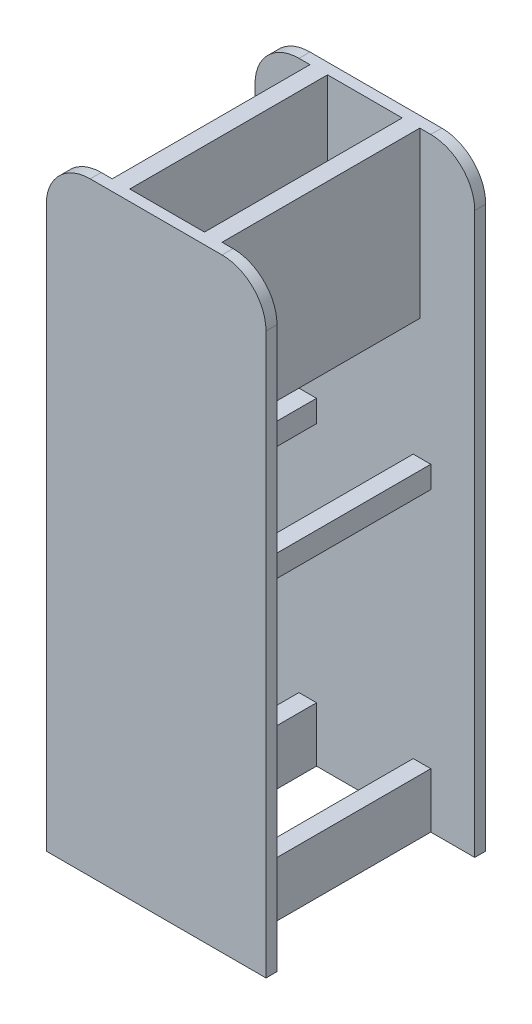
ISO-10303-21;
HEADER;
FILE_DESCRIPTION(('STEP AP214'),'2;1');
FILE_NAME('part.step','',(''),(''),'','','');
FILE_SCHEMA(('AUTOMOTIVE_DESIGN { 1 0 10303 214 1 1 1 1 }'));
ENDSEC;
DATA;
#1=APPLICATION_CONTEXT('core data for automotive mechanical design processes');
#2=APPLICATION_PROTOCOL_DEFINITION('international standard','automotive_design',2000,#1);
#3=PRODUCT_CONTEXT('',#1,'mechanical');
#4=PRODUCT('Part','Part','',(#3));
#5=PRODUCT_RELATED_PRODUCT_CATEGORY('part','',(#4));
#6=PRODUCT_DEFINITION_FORMATION('','',#4);
#7=PRODUCT_DEFINITION_CONTEXT('part definition',#1,'design');
#8=PRODUCT_DEFINITION('design','',#6,#7);
#9=PRODUCT_DEFINITION_SHAPE('','',#8);
#10=(LENGTH_UNIT() NAMED_UNIT(*) SI_UNIT(.MILLI.,.METRE.));
#11=(NAMED_UNIT(*) PLANE_ANGLE_UNIT() SI_UNIT($,.RADIAN.));
#12=(NAMED_UNIT(*) SI_UNIT($,.STERADIAN.) SOLID_ANGLE_UNIT());
#13=UNCERTAINTY_MEASURE_WITH_UNIT(LENGTH_MEASURE(1.E-05),#10,'distance_accuracy_value','');
#14=(GEOMETRIC_REPRESENTATION_CONTEXT(3) GLOBAL_UNCERTAINTY_ASSIGNED_CONTEXT((#13)) GLOBAL_UNIT_ASSIGNED_CONTEXT((#10,
#11,#12)) REPRESENTATION_CONTEXT('',''));
#15=CARTESIAN_POINT('',(0.,0.,0.));
#16=DIRECTION('',(0.,0.,1.));
#17=DIRECTION('',(1.,0.,0.));
#18=AXIS2_PLACEMENT_3D('',#15,#16,#17);
#19=CARTESIAN_POINT('',(0.,0.,10.));
#20=DIRECTION('',(0.,0.,-1.));
#21=DIRECTION('',(-1.,0.,0.));
#22=AXIS2_PLACEMENT_3D('',#19,#20,#21);
#23=PLANE('',#22);
#24=DIRECTION('',(-1.,0.,0.));
#25=VECTOR('',#24,1.);
#26=CARTESIAN_POINT('',(56.,290.,10.));
#27=LINE('',#26,#25);
#28=CARTESIAN_POINT('',(56.,290.,10.));
#29=VERTEX_POINT('',#28);
#30=CARTESIAN_POINT('',(40.,290.,10.));
#31=VERTEX_POINT('',#30);
#32=EDGE_CURVE('E418',#29,#31,#27,.T.);
#33=ORIENTED_EDGE('',*,*,#32,.F.);
#34=DIRECTION('',(0.,1.,0.));
#35=VECTOR('',#34,1.);
#36=CARTESIAN_POINT('',(56.,290.,10.));
#37=LINE('',#36,#35);
#38=CARTESIAN_POINT('',(56.,270.,10.));
#39=VERTEX_POINT('',#38);
#40=EDGE_CURVE('E430',#39,#29,#37,.T.);
#41=ORIENTED_EDGE('',*,*,#40,.F.);
#42=DIRECTION('',(1.,0.,0.));
#43=VECTOR('',#42,1.);
#44=CARTESIAN_POINT('',(56.,270.,10.));
#45=LINE('',#44,#43);
#46=CARTESIAN_POINT('',(40.0000000000001,270.,10.));
#47=VERTEX_POINT('',#46);
#48=EDGE_CURVE('E426',#47,#39,#45,.T.);
#49=ORIENTED_EDGE('',*,*,#48,.F.);
#50=DIRECTION('',(0.,-1.,0.));
#51=VECTOR('',#50,1.);
#52=CARTESIAN_POINT('',(40.,290.,10.));
#53=LINE('',#52,#51);
#54=EDGE_CURVE('E422',#31,#47,#53,.T.);
#55=ORIENTED_EDGE('',*,*,#54,.F.);
#56=EDGE_LOOP('',(#33,#41,#49,#55));
#57=FACE_BOUND('',#56,.T.);
#58=DIRECTION('',(0.,-1.,0.));
#59=VECTOR('',#58,1.);
#60=CARTESIAN_POINT('',(144.,290.,10.));
#61=LINE('',#60,#59);
#62=CARTESIAN_POINT('',(144.,290.,10.));
#63=VERTEX_POINT('',#62);
#64=CARTESIAN_POINT('',(144.,270.,10.));
#65=VERTEX_POINT('',#64);
#66=EDGE_CURVE('E478',#63,#65,#61,.T.);
#67=ORIENTED_EDGE('',*,*,#66,.F.);
#68=DIRECTION('',(-1.,0.,0.));
#69=VECTOR('',#68,1.);
#70=CARTESIAN_POINT('',(144.,290.,10.));
#71=LINE('',#70,#69);
#72=CARTESIAN_POINT('',(160.,290.,10.));
#73=VERTEX_POINT('',#72);
#74=EDGE_CURVE('E490',#73,#63,#71,.T.);
#75=ORIENTED_EDGE('',*,*,#74,.F.);
#76=DIRECTION('',(0.,1.,0.));
#77=VECTOR('',#76,1.);
#78=CARTESIAN_POINT('',(160.,290.,10.));
#79=LINE('',#78,#77);
#80=CARTESIAN_POINT('',(160.,270.,10.));
#81=VERTEX_POINT('',#80);
#82=EDGE_CURVE('E486',#81,#73,#79,.T.);
#83=ORIENTED_EDGE('',*,*,#82,.F.);
#84=DIRECTION('',(1.,0.,0.));
#85=VECTOR('',#84,1.);
#86=CARTESIAN_POINT('',(144.,270.,10.));
#87=LINE('',#86,#85);
#88=EDGE_CURVE('E482',#65,#81,#87,.T.);
#89=ORIENTED_EDGE('',*,*,#88,.F.);
#90=EDGE_LOOP('',(#67,#75,#83,#89));
#91=FACE_BOUND('',#90,.T.);
#92=DIRECTION('',(0.,1.,0.));
#93=VECTOR('',#92,1.);
#94=CARTESIAN_POINT('',(66.,550.,10.));
#95=LINE('',#94,#93);
#96=CARTESIAN_POINT('',(66.,400.,10.));
#97=VERTEX_POINT('',#96);
#98=CARTESIAN_POINT('',(66.,550.,10.));
#99=VERTEX_POINT('',#98);
#100=EDGE_CURVE('E390',#97,#99,#95,.T.);
#101=ORIENTED_EDGE('',*,*,#100,.F.);
#102=DIRECTION('',(1.,0.,0.));
#103=VECTOR('',#102,1.);
#104=CARTESIAN_POINT('',(66.,400.,10.));
#105=LINE('',#104,#103);
#106=CARTESIAN_POINT('',(50.,400.,10.));
#107=VERTEX_POINT('',#106);
#108=EDGE_CURVE('E398',#107,#97,#105,.T.);
#109=ORIENTED_EDGE('',*,*,#108,.F.);
#110=DIRECTION('',(0.,-1.,0.));
#111=VECTOR('',#110,1.);
#112=CARTESIAN_POINT('',(50.,550.,10.));
#113=LINE('',#112,#111);
#114=CARTESIAN_POINT('',(50.,550.,10.));
#115=VERTEX_POINT('',#114);
#116=EDGE_CURVE('E394',#115,#107,#113,.T.);
#117=ORIENTED_EDGE('',*,*,#116,.F.);
#118=DIRECTION('',(-1.,0.,0.));
#119=VECTOR('',#118,1.);
#120=CARTESIAN_POINT('',(0.,550.,10.));
#121=LINE('',#120,#119);
#122=CARTESIAN_POINT('',(40.,550.,10.));
#123=VERTEX_POINT('',#122);
#124=EDGE_CURVE('E580',#115,#123,#121,.T.);
#125=ORIENTED_EDGE('',*,*,#124,.T.);
#126=CARTESIAN_POINT('',(40.,510.,10.));
#127=DIRECTION('',(0.,0.,-1.));
#128=DIRECTION('',(-1.,0.,0.));
#129=AXIS2_PLACEMENT_3D('',#126,#127,#128);
#130=CIRCLE('',#129,40.);
#131=CARTESIAN_POINT('',(0.,510.,10.));
#132=VERTEX_POINT('',#131);
#133=EDGE_CURVE('E626',#123,#132,#130,.F.);
#134=ORIENTED_EDGE('',*,*,#133,.T.);
#135=DIRECTION('',(0.,-1.,0.));
#136=VECTOR('',#135,1.);
#137=CARTESIAN_POINT('',(0.,0.,10.));
#138=LINE('',#137,#136);
#139=CARTESIAN_POINT('',(0.,0.,10.));
#140=VERTEX_POINT('',#139);
#141=EDGE_CURVE('E567',#132,#140,#138,.T.);
#142=ORIENTED_EDGE('',*,*,#141,.T.);
#143=DIRECTION('',(1.,0.,0.));
#144=VECTOR('',#143,1.);
#145=CARTESIAN_POINT('',(0.,0.,10.));
#146=LINE('',#145,#144);
#147=CARTESIAN_POINT('',(40.,0.,10.));
#148=VERTEX_POINT('',#147);
#149=EDGE_CURVE('E572',#140,#148,#146,.T.);
#150=ORIENTED_EDGE('',*,*,#149,.T.);
#151=DIRECTION('',(0.,-1.,0.));
#152=VECTOR('',#151,1.);
#153=CARTESIAN_POINT('',(40.,0.,10.));
#154=LINE('',#153,#152);
#155=CARTESIAN_POINT('',(40.,50.,10.));
#156=VERTEX_POINT('',#155);
#157=EDGE_CURVE('E458',#156,#148,#154,.T.);
#158=ORIENTED_EDGE('',*,*,#157,.F.);
#159=DIRECTION('',(-1.,0.,0.));
#160=VECTOR('',#159,1.);
#161=CARTESIAN_POINT('',(56.,50.,10.));
#162=LINE('',#161,#160);
#163=CARTESIAN_POINT('',(56.,50.,10.));
#164=VERTEX_POINT('',#163);
#165=EDGE_CURVE('E454',#164,#156,#162,.T.);
#166=ORIENTED_EDGE('',*,*,#165,.F.);
#167=DIRECTION('',(0.,1.,0.));
#168=VECTOR('',#167,1.);
#169=CARTESIAN_POINT('',(56.,0.,10.));
#170=LINE('',#169,#168);
#171=CARTESIAN_POINT('',(56.,0.,10.));
#172=VERTEX_POINT('',#171);
#173=EDGE_CURVE('E450',#172,#164,#170,.T.);
#174=ORIENTED_EDGE('',*,*,#173,.F.);
#175=CARTESIAN_POINT('',(144.,0.,10.));
#176=VERTEX_POINT('',#175);
#177=EDGE_CURVE('E576',#172,#176,#146,.T.);
#178=ORIENTED_EDGE('',*,*,#177,.T.);
#179=DIRECTION('',(0.,-1.,0.));
#180=VECTOR('',#179,1.);
#181=CARTESIAN_POINT('',(144.,0.,10.));
#182=LINE('',#181,#180);
#183=CARTESIAN_POINT('',(144.,50.,10.));
#184=VERTEX_POINT('',#183);
#185=EDGE_CURVE('E510',#184,#176,#182,.T.);
#186=ORIENTED_EDGE('',*,*,#185,.F.);
#187=DIRECTION('',(-1.,0.,0.));
#188=VECTOR('',#187,1.);
#189=CARTESIAN_POINT('',(144.,50.,10.));
#190=LINE('',#189,#188);
#191=CARTESIAN_POINT('',(160.,50.,10.));
#192=VERTEX_POINT('',#191);
#193=EDGE_CURVE('E518',#192,#184,#190,.T.);
#194=ORIENTED_EDGE('',*,*,#193,.F.);
#195=DIRECTION('',(0.,1.,0.));
#196=VECTOR('',#195,1.);
#197=CARTESIAN_POINT('',(160.,0.,10.));
#198=LINE('',#197,#196);
#199=CARTESIAN_POINT('',(160.,0.,10.));
#200=VERTEX_POINT('',#199);
#201=EDGE_CURVE('E514',#200,#192,#198,.T.);
#202=ORIENTED_EDGE('',*,*,#201,.F.);
#203=CARTESIAN_POINT('',(200.,0.,10.));
#204=VERTEX_POINT('',#203);
#205=EDGE_CURVE('E570',#200,#204,#146,.T.);
#206=ORIENTED_EDGE('',*,*,#205,.T.);
#207=DIRECTION('',(0.,1.,0.));
#208=VECTOR('',#207,1.);
#209=CARTESIAN_POINT('',(200.,0.,10.));
#210=LINE('',#209,#208);
#211=CARTESIAN_POINT('',(200.,510.,10.));
#212=VERTEX_POINT('',#211);
#213=EDGE_CURVE('E575',#204,#212,#210,.T.);
#214=ORIENTED_EDGE('',*,*,#213,.T.);
#215=CARTESIAN_POINT('',(160.,510.,10.));
#216=DIRECTION('',(0.,0.,-1.));
#217=DIRECTION('',(-1.,0.,0.));
#218=AXIS2_PLACEMENT_3D('',#215,#216,#217);
#219=CIRCLE('',#218,40.);
#220=CARTESIAN_POINT('',(160.,550.,10.));
#221=VERTEX_POINT('',#220);
#222=EDGE_CURVE('E623',#212,#221,#219,.F.);
#223=ORIENTED_EDGE('',*,*,#222,.T.);
#224=CARTESIAN_POINT('',(150.,550.,10.));
#225=VERTEX_POINT('',#224);
#226=EDGE_CURVE('E581',#221,#225,#121,.T.);
#227=ORIENTED_EDGE('',*,*,#226,.T.);
#228=DIRECTION('',(0.,1.,0.));
#229=VECTOR('',#228,1.);
#230=CARTESIAN_POINT('',(150.,550.,10.));
#231=LINE('',#230,#229);
#232=CARTESIAN_POINT('',(150.,400.,10.));
#233=VERTEX_POINT('',#232);
#234=EDGE_CURVE('E546',#233,#225,#231,.T.);
#235=ORIENTED_EDGE('',*,*,#234,.F.);
#236=DIRECTION('',(1.,0.,0.));
#237=VECTOR('',#236,1.);
#238=CARTESIAN_POINT('',(134.,400.,10.));
#239=LINE('',#238,#237);
#240=CARTESIAN_POINT('',(134.,400.,10.));
#241=VERTEX_POINT('',#240);
#242=EDGE_CURVE('E542',#241,#233,#239,.T.);
#243=ORIENTED_EDGE('',*,*,#242,.F.);
#244=DIRECTION('',(0.,-1.,0.));
#245=VECTOR('',#244,1.);
#246=CARTESIAN_POINT('',(134.,550.,10.));
#247=LINE('',#246,#245);
#248=CARTESIAN_POINT('',(134.,550.,10.));
#249=VERTEX_POINT('',#248);
#250=EDGE_CURVE('E538',#249,#241,#247,.T.);
#251=ORIENTED_EDGE('',*,*,#250,.F.);
#252=EDGE_CURVE('E585',#249,#99,#121,.T.);
#253=ORIENTED_EDGE('',*,*,#252,.T.);
#254=EDGE_LOOP('',(#101,#109,#117,#125,#134,#142,#150,#158,#166,#174,#178,#186,#194,#202,#206,
#214,#223,#227,#235,#243,#251,#253));
#255=FACE_BOUND('',#254,.T.);
#256=ADVANCED_FACE('F39',(#57,#91,#255),#23,.F.);
#257=CARTESIAN_POINT('',(0.,0.,10.));
#258=DIRECTION('',(1.,0.,0.));
#259=DIRECTION('',(0.,0.,-1.));
#260=AXIS2_PLACEMENT_3D('',#257,#258,#259);
#261=PLANE('',#260);
#262=ORIENTED_EDGE('',*,*,#141,.F.);
#263=DIRECTION('',(0.,0.,-1.));
#264=VECTOR('',#263,1.);
#265=CARTESIAN_POINT('',(0.,510.,10.));
#266=LINE('',#265,#264);
#267=CARTESIAN_POINT('',(0.,510.,0.));
#268=VERTEX_POINT('',#267);
#269=EDGE_CURVE('E605',#132,#268,#266,.T.);
#270=ORIENTED_EDGE('',*,*,#269,.T.);
#271=DIRECTION('',(0.,-1.,0.));
#272=VECTOR('',#271,1.);
#273=CARTESIAN_POINT('',(0.,0.,0.));
#274=LINE('',#273,#272);
#275=CARTESIAN_POINT('',(0.,0.,0.));
#276=VERTEX_POINT('',#275);
#277=EDGE_CURVE('E566',#268,#276,#274,.T.);
#278=ORIENTED_EDGE('',*,*,#277,.T.);
#279=DIRECTION('',(0.,0.,-1.));
#280=VECTOR('',#279,1.);
#281=CARTESIAN_POINT('',(0.,0.,10.));
#282=LINE('',#281,#280);
#283=EDGE_CURVE('E601',#140,#276,#282,.T.);
#284=ORIENTED_EDGE('',*,*,#283,.F.);
#285=EDGE_LOOP('',(#262,#270,#278,#284));
#286=FACE_BOUND('',#285,.T.);
#287=ADVANCED_FACE('F698',(#286),#261,.F.);
#288=CARTESIAN_POINT('',(0.,0.,10.));
#289=DIRECTION('',(0.,1.,0.));
#290=DIRECTION('',(0.,0.,1.));
#291=AXIS2_PLACEMENT_3D('',#288,#289,#290);
#292=PLANE('',#291);
#293=DIRECTION('',(0.,0.,-1.));
#294=VECTOR('',#293,1.);
#295=CARTESIAN_POINT('',(160.,0.,100.));
#296=LINE('',#295,#294);
#297=CARTESIAN_POINT('',(160.,0.,190.));
#298=VERTEX_POINT('',#297);
#299=EDGE_CURVE('E530',#298,#200,#296,.T.);
#300=ORIENTED_EDGE('',*,*,#299,.F.);
#301=DIRECTION('',(1.,0.,0.));
#302=VECTOR('',#301,1.);
#303=CARTESIAN_POINT('',(0.,0.,190.));
#304=LINE('',#303,#302);
#305=CARTESIAN_POINT('',(200.,0.,190.));
#306=VERTEX_POINT('',#305);
#307=EDGE_CURVE('E732',#298,#306,#304,.T.);
#308=ORIENTED_EDGE('',*,*,#307,.T.);
#309=DIRECTION('',(0.,0.,-1.));
#310=VECTOR('',#309,1.);
#311=CARTESIAN_POINT('',(200.,0.,200.));
#312=LINE('',#311,#310);
#313=CARTESIAN_POINT('',(200.,0.,200.));
#314=VERTEX_POINT('',#313);
#315=EDGE_CURVE('E295',#314,#306,#312,.T.);
#316=ORIENTED_EDGE('',*,*,#315,.F.);
#317=DIRECTION('',(1.,0.,0.));
#318=VECTOR('',#317,1.);
#319=CARTESIAN_POINT('',(0.,0.,200.));
#320=LINE('',#319,#318);
#321=CARTESIAN_POINT('',(0.,0.,200.));
#322=VERTEX_POINT('',#321);
#323=EDGE_CURVE('E277',#322,#314,#320,.T.);
#324=ORIENTED_EDGE('',*,*,#323,.F.);
#325=DIRECTION('',(0.,0.,-1.));
#326=VECTOR('',#325,1.);
#327=CARTESIAN_POINT('',(0.,0.,200.));
#328=LINE('',#327,#326);
#329=CARTESIAN_POINT('',(0.,0.,190.));
#330=VERTEX_POINT('',#329);
#331=EDGE_CURVE('E293',#322,#330,#328,.T.);
#332=ORIENTED_EDGE('',*,*,#331,.T.);
#333=CARTESIAN_POINT('',(40.,0.,190.));
#334=VERTEX_POINT('',#333);
#335=EDGE_CURVE('E730',#330,#334,#304,.T.);
#336=ORIENTED_EDGE('',*,*,#335,.T.);
#337=DIRECTION('',(0.,0.,-1.));
#338=VECTOR('',#337,1.);
#339=CARTESIAN_POINT('',(40.,0.,100.));
#340=LINE('',#339,#338);
#341=EDGE_CURVE('E466',#334,#148,#340,.T.);
#342=ORIENTED_EDGE('',*,*,#341,.T.);
#343=ORIENTED_EDGE('',*,*,#149,.F.);
#344=ORIENTED_EDGE('',*,*,#283,.T.);
#345=DIRECTION('',(1.,0.,0.));
#346=VECTOR('',#345,1.);
#347=CARTESIAN_POINT('',(0.,0.,0.));
#348=LINE('',#347,#346);
#349=CARTESIAN_POINT('',(200.,0.,0.));
#350=VERTEX_POINT('',#349);
#351=EDGE_CURVE('E588',#276,#350,#348,.T.);
#352=ORIENTED_EDGE('',*,*,#351,.T.);
#353=DIRECTION('',(0.,0.,-1.));
#354=VECTOR('',#353,1.);
#355=CARTESIAN_POINT('',(200.,0.,10.));
#356=LINE('',#355,#354);
#357=EDGE_CURVE('E584',#204,#350,#356,.T.);
#358=ORIENTED_EDGE('',*,*,#357,.F.);
#359=ORIENTED_EDGE('',*,*,#205,.F.);
#360=EDGE_LOOP('',(#300,#308,#316,#324,#332,#336,#342,#343,#344,#352,#358,#359));
#361=FACE_BOUND('',#360,.T.);
#362=CARTESIAN_POINT('',(56.,0.,190.));
#363=VERTEX_POINT('',#362);
#364=CARTESIAN_POINT('',(144.,0.,190.));
#365=VERTEX_POINT('',#364);
#366=EDGE_CURVE('E735',#363,#365,#304,.T.);
#367=ORIENTED_EDGE('',*,*,#366,.T.);
#368=DIRECTION('',(0.,0.,-1.));
#369=VECTOR('',#368,1.);
#370=CARTESIAN_POINT('',(144.,0.,100.));
#371=LINE('',#370,#369);
#372=EDGE_CURVE('E534',#365,#176,#371,.T.);
#373=ORIENTED_EDGE('',*,*,#372,.T.);
#374=ORIENTED_EDGE('',*,*,#177,.F.);
#375=DIRECTION('',(0.,0.,-1.));
#376=VECTOR('',#375,1.);
#377=CARTESIAN_POINT('',(56.,0.,100.));
#378=LINE('',#377,#376);
#379=EDGE_CURVE('E462',#363,#172,#378,.T.);
#380=ORIENTED_EDGE('',*,*,#379,.F.);
#381=EDGE_LOOP('',(#367,#373,#374,#380));
#382=FACE_BOUND('',#381,.T.);
#383=ADVANCED_FACE('F290',(#361,#382),#292,.F.);
#384=CARTESIAN_POINT('',(200.,0.,10.));
#385=DIRECTION('',(-1.,0.,0.));
#386=DIRECTION('',(0.,0.,1.));
#387=AXIS2_PLACEMENT_3D('',#384,#385,#386);
#388=PLANE('',#387);
#389=DIRECTION('',(0.,1.,0.));
#390=VECTOR('',#389,1.);
#391=CARTESIAN_POINT('',(200.,0.,0.));
#392=LINE('',#391,#390);
#393=CARTESIAN_POINT('',(200.,510.,0.));
#394=VERTEX_POINT('',#393);
#395=EDGE_CURVE('E591',#350,#394,#392,.T.);
#396=ORIENTED_EDGE('',*,*,#395,.T.);
#397=DIRECTION('',(0.,0.,-1.));
#398=VECTOR('',#397,1.);
#399=CARTESIAN_POINT('',(200.,510.,10.));
#400=LINE('',#399,#398);
#401=EDGE_CURVE('E629',#394,#212,#400,.F.);
#402=ORIENTED_EDGE('',*,*,#401,.T.);
#403=ORIENTED_EDGE('',*,*,#213,.F.);
#404=ORIENTED_EDGE('',*,*,#357,.T.);
#405=EDGE_LOOP('',(#396,#402,#403,#404));
#406=FACE_BOUND('',#405,.T.);
#407=ADVANCED_FACE('F662',(#406),#388,.F.);
#408=CARTESIAN_POINT('',(0.,550.,10.));
#409=DIRECTION('',(0.,-1.,0.));
#410=DIRECTION('',(0.,0.,-1.));
#411=AXIS2_PLACEMENT_3D('',#408,#409,#410);
#412=PLANE('',#411);
#413=DIRECTION('',(0.,0.,-1.));
#414=VECTOR('',#413,1.);
#415=CARTESIAN_POINT('',(134.,550.,100.));
#416=LINE('',#415,#414);
#417=CARTESIAN_POINT('',(134.,550.,190.));
#418=VERTEX_POINT('',#417);
#419=EDGE_CURVE('E550',#418,#249,#416,.T.);
#420=ORIENTED_EDGE('',*,*,#419,.F.);
#421=DIRECTION('',(-1.,0.,0.));
#422=VECTOR('',#421,1.);
#423=CARTESIAN_POINT('',(0.,550.,190.));
#424=LINE('',#423,#422);
#425=CARTESIAN_POINT('',(66.,550.,190.));
#426=VERTEX_POINT('',#425);
#427=EDGE_CURVE('E745',#418,#426,#424,.T.);
#428=ORIENTED_EDGE('',*,*,#427,.T.);
#429=DIRECTION('',(0.,0.,-1.));
#430=VECTOR('',#429,1.);
#431=CARTESIAN_POINT('',(66.,550.,100.));
#432=LINE('',#431,#430);
#433=EDGE_CURVE('E414',#426,#99,#432,.T.);
#434=ORIENTED_EDGE('',*,*,#433,.T.);
#435=ORIENTED_EDGE('',*,*,#252,.F.);
#436=EDGE_LOOP('',(#420,#428,#434,#435));
#437=FACE_BOUND('',#436,.T.);
#438=CARTESIAN_POINT('',(50.,550.,190.));
#439=VERTEX_POINT('',#438);
#440=CARTESIAN_POINT('',(40.,550.,190.));
#441=VERTEX_POINT('',#440);
#442=EDGE_CURVE('E743',#439,#441,#424,.T.);
#443=ORIENTED_EDGE('',*,*,#442,.T.);
#444=DIRECTION('',(0.,0.,-1.));
#445=VECTOR('',#444,1.);
#446=CARTESIAN_POINT('',(40.,550.,10.));
#447=LINE('',#446,#445);
#448=CARTESIAN_POINT('',(40.,550.,200.));
#449=VERTEX_POINT('',#448);
#450=EDGE_CURVE('E61',#441,#449,#447,.F.);
#451=ORIENTED_EDGE('',*,*,#450,.T.);
#452=DIRECTION('',(-1.,0.,0.));
#453=VECTOR('',#452,1.);
#454=CARTESIAN_POINT('',(0.,550.,200.));
#455=LINE('',#454,#453);
#456=CARTESIAN_POINT('',(160.,550.,200.));
#457=VERTEX_POINT('',#456);
#458=EDGE_CURVE('E311',#457,#449,#455,.T.);
#459=ORIENTED_EDGE('',*,*,#458,.F.);
#460=DIRECTION('',(0.,0.,-1.));
#461=VECTOR('',#460,1.);
#462=CARTESIAN_POINT('',(160.,550.,10.));
#463=LINE('',#462,#461);
#464=CARTESIAN_POINT('',(160.,550.,190.));
#465=VERTEX_POINT('',#464);
#466=EDGE_CURVE('E641',#457,#465,#463,.T.);
#467=ORIENTED_EDGE('',*,*,#466,.T.);
#468=CARTESIAN_POINT('',(150.,550.,190.));
#469=VERTEX_POINT('',#468);
#470=EDGE_CURVE('E285',#465,#469,#424,.T.);
#471=ORIENTED_EDGE('',*,*,#470,.T.);
#472=DIRECTION('',(0.,0.,-1.));
#473=VECTOR('',#472,1.);
#474=CARTESIAN_POINT('',(150.,550.,100.));
#475=LINE('',#474,#473);
#476=EDGE_CURVE('E554',#469,#225,#475,.T.);
#477=ORIENTED_EDGE('',*,*,#476,.T.);
#478=ORIENTED_EDGE('',*,*,#226,.F.);
#479=DIRECTION('',(0.,0.,-1.));
#480=VECTOR('',#479,1.);
#481=CARTESIAN_POINT('',(160.,550.,10.));
#482=LINE('',#481,#480);
#483=CARTESIAN_POINT('',(160.,550.,0.));
#484=VERTEX_POINT('',#483);
#485=EDGE_CURVE('E615',#221,#484,#482,.T.);
#486=ORIENTED_EDGE('',*,*,#485,.T.);
#487=DIRECTION('',(-1.,0.,0.));
#488=VECTOR('',#487,1.);
#489=CARTESIAN_POINT('',(0.,550.,0.));
#490=LINE('',#489,#488);
#491=CARTESIAN_POINT('',(40.,550.,0.));
#492=VERTEX_POINT('',#491);
#493=EDGE_CURVE('E571',#484,#492,#490,.T.);
#494=ORIENTED_EDGE('',*,*,#493,.T.);
#495=DIRECTION('',(0.,0.,-1.));
#496=VECTOR('',#495,1.);
#497=CARTESIAN_POINT('',(40.,550.,10.));
#498=LINE('',#497,#496);
#499=EDGE_CURVE('E619',#492,#123,#498,.F.);
#500=ORIENTED_EDGE('',*,*,#499,.T.);
#501=ORIENTED_EDGE('',*,*,#124,.F.);
#502=DIRECTION('',(0.,0.,-1.));
#503=VECTOR('',#502,1.);
#504=CARTESIAN_POINT('',(50.,550.,100.));
#505=LINE('',#504,#503);
#506=EDGE_CURVE('E410',#439,#115,#505,.T.);
#507=ORIENTED_EDGE('',*,*,#506,.F.);
#508=EDGE_LOOP('',(#443,#451,#459,#467,#471,#477,#478,#486,#494,#500,#501,#507));
#509=FACE_BOUND('',#508,.T.);
#510=ADVANCED_FACE('F668',(#437,#509),#412,.F.);
#511=CARTESIAN_POINT('',(0.,0.,0.));
#512=DIRECTION('',(0.,0.,-1.));
#513=DIRECTION('',(-1.,0.,0.));
#514=AXIS2_PLACEMENT_3D('',#511,#512,#513);
#515=PLANE('',#514);
#516=ORIENTED_EDGE('',*,*,#277,.F.);
#517=CARTESIAN_POINT('',(40.,510.,0.));
#518=DIRECTION('',(0.,0.,-1.));
#519=DIRECTION('',(-1.,0.,0.));
#520=AXIS2_PLACEMENT_3D('',#517,#518,#519);
#521=CIRCLE('',#520,40.);
#522=EDGE_CURVE('E612',#268,#492,#521,.T.);
#523=ORIENTED_EDGE('',*,*,#522,.T.);
#524=ORIENTED_EDGE('',*,*,#493,.F.);
#525=CARTESIAN_POINT('',(160.,510.,0.));
#526=DIRECTION('',(0.,0.,-1.));
#527=DIRECTION('',(-1.,0.,0.));
#528=AXIS2_PLACEMENT_3D('',#525,#526,#527);
#529=CIRCLE('',#528,40.);
#530=EDGE_CURVE('E609',#484,#394,#529,.T.);
#531=ORIENTED_EDGE('',*,*,#530,.T.);
#532=ORIENTED_EDGE('',*,*,#395,.F.);
#533=ORIENTED_EDGE('',*,*,#351,.F.);
#534=EDGE_LOOP('',(#516,#523,#524,#531,#532,#533));
#535=FACE_BOUND('',#534,.T.);
#536=ADVANCED_FACE('F707',(#535),#515,.T.);
#537=CARTESIAN_POINT('',(40.,510.,10.));
#538=DIRECTION('',(0.,0.,-1.));
#539=DIRECTION('',(-1.,0.,0.));
#540=AXIS2_PLACEMENT_3D('',#537,#538,#539);
#541=CYLINDRICAL_SURFACE('',#540,40.);
#542=ORIENTED_EDGE('',*,*,#133,.F.);
#543=ORIENTED_EDGE('',*,*,#499,.F.);
#544=ORIENTED_EDGE('',*,*,#522,.F.);
#545=ORIENTED_EDGE('',*,*,#269,.F.);
#546=EDGE_LOOP('',(#542,#543,#544,#545));
#547=FACE_BOUND('',#546,.T.);
#548=ADVANCED_FACE('F694',(#547),#541,.T.);
#549=CARTESIAN_POINT('',(160.,510.,10.));
#550=DIRECTION('',(0.,0.,-1.));
#551=DIRECTION('',(-1.,0.,0.));
#552=AXIS2_PLACEMENT_3D('',#549,#550,#551);
#553=CYLINDRICAL_SURFACE('',#552,40.);
#554=ORIENTED_EDGE('',*,*,#222,.F.);
#555=ORIENTED_EDGE('',*,*,#401,.F.);
#556=ORIENTED_EDGE('',*,*,#530,.F.);
#557=ORIENTED_EDGE('',*,*,#485,.F.);
#558=EDGE_LOOP('',(#554,#555,#556,#557));
#559=FACE_BOUND('',#558,.T.);
#560=ADVANCED_FACE('F665',(#559),#553,.T.);
#561=CARTESIAN_POINT('',(134.,550.,100.));
#562=DIRECTION('',(1.,0.,0.));
#563=DIRECTION('',(0.,0.,-1.));
#564=AXIS2_PLACEMENT_3D('',#561,#562,#563);
#565=PLANE('',#564);
#566=ORIENTED_EDGE('',*,*,#250,.T.);
#567=DIRECTION('',(0.,0.,-1.));
#568=VECTOR('',#567,1.);
#569=CARTESIAN_POINT('',(134.,400.,100.));
#570=LINE('',#569,#568);
#571=CARTESIAN_POINT('',(134.,400.,190.));
#572=VERTEX_POINT('',#571);
#573=EDGE_CURVE('E562',#572,#241,#570,.T.);
#574=ORIENTED_EDGE('',*,*,#573,.F.);
#575=DIRECTION('',(0.,-1.,0.));
#576=VECTOR('',#575,1.);
#577=CARTESIAN_POINT('',(134.,550.,190.));
#578=LINE('',#577,#576);
#579=EDGE_CURVE('E378',#418,#572,#578,.T.);
#580=ORIENTED_EDGE('',*,*,#579,.F.);
#581=ORIENTED_EDGE('',*,*,#419,.T.);
#582=EDGE_LOOP('',(#566,#574,#580,#581));
#583=FACE_BOUND('',#582,.T.);
#584=ADVANCED_FACE('F686',(#583),#565,.F.);
#585=CARTESIAN_POINT('',(134.,400.,100.));
#586=DIRECTION('',(0.,1.,0.));
#587=DIRECTION('',(0.,0.,1.));
#588=AXIS2_PLACEMENT_3D('',#585,#586,#587);
#589=PLANE('',#588);
#590=ORIENTED_EDGE('',*,*,#242,.T.);
#591=DIRECTION('',(0.,0.,-1.));
#592=VECTOR('',#591,1.);
#593=CARTESIAN_POINT('',(150.,400.,100.));
#594=LINE('',#593,#592);
#595=CARTESIAN_POINT('',(150.,400.,190.));
#596=VERTEX_POINT('',#595);
#597=EDGE_CURVE('E558',#596,#233,#594,.T.);
#598=ORIENTED_EDGE('',*,*,#597,.F.);
#599=DIRECTION('',(1.,0.,0.));
#600=VECTOR('',#599,1.);
#601=CARTESIAN_POINT('',(134.,400.,190.));
#602=LINE('',#601,#600);
#603=EDGE_CURVE('E386',#572,#596,#602,.T.);
#604=ORIENTED_EDGE('',*,*,#603,.F.);
#605=ORIENTED_EDGE('',*,*,#573,.T.);
#606=EDGE_LOOP('',(#590,#598,#604,#605));
#607=FACE_BOUND('',#606,.T.);
#608=ADVANCED_FACE('F680',(#607),#589,.F.);
#609=CARTESIAN_POINT('',(150.,550.,100.));
#610=DIRECTION('',(-1.,0.,0.));
#611=DIRECTION('',(0.,0.,1.));
#612=AXIS2_PLACEMENT_3D('',#609,#610,#611);
#613=PLANE('',#612);
#614=ORIENTED_EDGE('',*,*,#234,.T.);
#615=ORIENTED_EDGE('',*,*,#476,.F.);
#616=DIRECTION('',(0.,1.,0.));
#617=VECTOR('',#616,1.);
#618=CARTESIAN_POINT('',(150.,550.,190.));
#619=LINE('',#618,#617);
#620=EDGE_CURVE('E382',#596,#469,#619,.T.);
#621=ORIENTED_EDGE('',*,*,#620,.F.);
#622=ORIENTED_EDGE('',*,*,#597,.T.);
#623=EDGE_LOOP('',(#614,#615,#621,#622));
#624=FACE_BOUND('',#623,.T.);
#625=ADVANCED_FACE('F674',(#624),#613,.F.);
#626=CARTESIAN_POINT('',(144.,0.,100.));
#627=DIRECTION('',(1.,0.,0.));
#628=DIRECTION('',(0.,0.,-1.));
#629=AXIS2_PLACEMENT_3D('',#626,#627,#628);
#630=PLANE('',#629);
#631=ORIENTED_EDGE('',*,*,#185,.T.);
#632=ORIENTED_EDGE('',*,*,#372,.F.);
#633=DIRECTION('',(0.,-1.,0.));
#634=VECTOR('',#633,1.);
#635=CARTESIAN_POINT('',(144.,0.,190.));
#636=LINE('',#635,#634);
#637=CARTESIAN_POINT('',(144.,50.,190.));
#638=VERTEX_POINT('',#637);
#639=EDGE_CURVE('E366',#638,#365,#636,.T.);
#640=ORIENTED_EDGE('',*,*,#639,.F.);
#641=DIRECTION('',(0.,0.,-1.));
#642=VECTOR('',#641,1.);
#643=CARTESIAN_POINT('',(144.,50.,100.));
#644=LINE('',#643,#642);
#645=EDGE_CURVE('E522',#638,#184,#644,.T.);
#646=ORIENTED_EDGE('',*,*,#645,.T.);
#647=EDGE_LOOP('',(#631,#632,#640,#646));
#648=FACE_BOUND('',#647,.T.);
#649=ADVANCED_FACE('F781',(#648),#630,.F.);
#650=CARTESIAN_POINT('',(160.,0.,100.));
#651=DIRECTION('',(-1.,0.,0.));
#652=DIRECTION('',(0.,0.,1.));
#653=AXIS2_PLACEMENT_3D('',#650,#651,#652);
#654=PLANE('',#653);
#655=ORIENTED_EDGE('',*,*,#201,.T.);
#656=DIRECTION('',(0.,0.,-1.));
#657=VECTOR('',#656,1.);
#658=CARTESIAN_POINT('',(160.,50.,100.));
#659=LINE('',#658,#657);
#660=CARTESIAN_POINT('',(160.,50.,190.));
#661=VERTEX_POINT('',#660);
#662=EDGE_CURVE('E526',#661,#192,#659,.T.);
#663=ORIENTED_EDGE('',*,*,#662,.F.);
#664=DIRECTION('',(0.,1.,0.));
#665=VECTOR('',#664,1.);
#666=CARTESIAN_POINT('',(160.,0.,190.));
#667=LINE('',#666,#665);
#668=EDGE_CURVE('E374',#298,#661,#667,.T.);
#669=ORIENTED_EDGE('',*,*,#668,.F.);
#670=ORIENTED_EDGE('',*,*,#299,.T.);
#671=EDGE_LOOP('',(#655,#663,#669,#670));
#672=FACE_BOUND('',#671,.T.);
#673=ADVANCED_FACE('F785',(#672),#654,.F.);
#674=CARTESIAN_POINT('',(144.,50.,100.));
#675=DIRECTION('',(0.,-1.,0.));
#676=DIRECTION('',(0.,0.,-1.));
#677=AXIS2_PLACEMENT_3D('',#674,#675,#676);
#678=PLANE('',#677);
#679=ORIENTED_EDGE('',*,*,#193,.T.);
#680=ORIENTED_EDGE('',*,*,#645,.F.);
#681=DIRECTION('',(-1.,0.,0.));
#682=VECTOR('',#681,1.);
#683=CARTESIAN_POINT('',(144.,50.,190.));
#684=LINE('',#683,#682);
#685=EDGE_CURVE('E370',#661,#638,#684,.T.);
#686=ORIENTED_EDGE('',*,*,#685,.F.);
#687=ORIENTED_EDGE('',*,*,#662,.T.);
#688=EDGE_LOOP('',(#679,#680,#686,#687));
#689=FACE_BOUND('',#688,.T.);
#690=ADVANCED_FACE('F783',(#689),#678,.F.);
#691=CARTESIAN_POINT('',(144.,290.,100.));
#692=DIRECTION('',(1.,0.,0.));
#693=DIRECTION('',(0.,0.,-1.));
#694=AXIS2_PLACEMENT_3D('',#691,#692,#693);
#695=PLANE('',#694);
#696=ORIENTED_EDGE('',*,*,#66,.T.);
#697=DIRECTION('',(0.,0.,-1.));
#698=VECTOR('',#697,1.);
#699=CARTESIAN_POINT('',(144.,270.,100.));
#700=LINE('',#699,#698);
#701=CARTESIAN_POINT('',(144.,270.,190.));
#702=VERTEX_POINT('',#701);
#703=EDGE_CURVE('E506',#702,#65,#700,.T.);
#704=ORIENTED_EDGE('',*,*,#703,.F.);
#705=DIRECTION('',(0.,-1.,0.));
#706=VECTOR('',#705,1.);
#707=CARTESIAN_POINT('',(144.,290.,190.));
#708=LINE('',#707,#706);
#709=CARTESIAN_POINT('',(144.,290.,190.));
#710=VERTEX_POINT('',#709);
#711=EDGE_CURVE('E350',#710,#702,#708,.T.);
#712=ORIENTED_EDGE('',*,*,#711,.F.);
#713=DIRECTION('',(0.,0.,-1.));
#714=VECTOR('',#713,1.);
#715=CARTESIAN_POINT('',(144.,290.,100.));
#716=LINE('',#715,#714);
#717=EDGE_CURVE('E494',#710,#63,#716,.T.);
#718=ORIENTED_EDGE('',*,*,#717,.T.);
#719=EDGE_LOOP('',(#696,#704,#712,#718));
#720=FACE_BOUND('',#719,.T.);
#721=ADVANCED_FACE('F839',(#720),#695,.F.);
#722=CARTESIAN_POINT('',(144.,270.,100.));
#723=DIRECTION('',(0.,1.,0.));
#724=DIRECTION('',(0.,0.,1.));
#725=AXIS2_PLACEMENT_3D('',#722,#723,#724);
#726=PLANE('',#725);
#727=ORIENTED_EDGE('',*,*,#88,.T.);
#728=DIRECTION('',(0.,0.,-1.));
#729=VECTOR('',#728,1.);
#730=CARTESIAN_POINT('',(160.,270.,100.));
#731=LINE('',#730,#729);
#732=CARTESIAN_POINT('',(160.,270.,190.));
#733=VERTEX_POINT('',#732);
#734=EDGE_CURVE('E502',#733,#81,#731,.T.);
#735=ORIENTED_EDGE('',*,*,#734,.F.);
#736=DIRECTION('',(1.,0.,0.));
#737=VECTOR('',#736,1.);
#738=CARTESIAN_POINT('',(144.,270.,190.));
#739=LINE('',#738,#737);
#740=EDGE_CURVE('E362',#702,#733,#739,.T.);
#741=ORIENTED_EDGE('',*,*,#740,.F.);
#742=ORIENTED_EDGE('',*,*,#703,.T.);
#743=EDGE_LOOP('',(#727,#735,#741,#742));
#744=FACE_BOUND('',#743,.T.);
#745=ADVANCED_FACE('F835',(#744),#726,.F.);
#746=CARTESIAN_POINT('',(160.,290.,100.));
#747=DIRECTION('',(-1.,0.,0.));
#748=DIRECTION('',(0.,-1.,0.));
#749=AXIS2_PLACEMENT_3D('',#746,#747,#748);
#750=PLANE('',#749);
#751=ORIENTED_EDGE('',*,*,#82,.T.);
#752=DIRECTION('',(0.,0.,-1.));
#753=VECTOR('',#752,1.);
#754=CARTESIAN_POINT('',(160.,290.,100.));
#755=LINE('',#754,#753);
#756=CARTESIAN_POINT('',(160.,290.,190.));
#757=VERTEX_POINT('',#756);
#758=EDGE_CURVE('E498',#757,#73,#755,.T.);
#759=ORIENTED_EDGE('',*,*,#758,.F.);
#760=DIRECTION('',(0.,1.,0.));
#761=VECTOR('',#760,1.);
#762=CARTESIAN_POINT('',(160.,290.,190.));
#763=LINE('',#762,#761);
#764=EDGE_CURVE('E358',#733,#757,#763,.T.);
#765=ORIENTED_EDGE('',*,*,#764,.F.);
#766=ORIENTED_EDGE('',*,*,#734,.T.);
#767=EDGE_LOOP('',(#751,#759,#765,#766));
#768=FACE_BOUND('',#767,.T.);
#769=ADVANCED_FACE('F831',(#768),#750,.F.);
#770=CARTESIAN_POINT('',(144.,290.,100.));
#771=DIRECTION('',(0.,-1.,0.));
#772=DIRECTION('',(1.,0.,0.));
#773=AXIS2_PLACEMENT_3D('',#770,#771,#772);
#774=PLANE('',#773);
#775=ORIENTED_EDGE('',*,*,#74,.T.);
#776=ORIENTED_EDGE('',*,*,#717,.F.);
#777=DIRECTION('',(-1.,0.,0.));
#778=VECTOR('',#777,1.);
#779=CARTESIAN_POINT('',(144.,290.,190.));
#780=LINE('',#779,#778);
#781=EDGE_CURVE('E354',#757,#710,#780,.T.);
#782=ORIENTED_EDGE('',*,*,#781,.F.);
#783=ORIENTED_EDGE('',*,*,#758,.T.);
#784=EDGE_LOOP('',(#775,#776,#782,#783));
#785=FACE_BOUND('',#784,.T.);
#786=ADVANCED_FACE('F828',(#785),#774,.F.);
#787=CARTESIAN_POINT('',(56.,0.,100.));
#788=DIRECTION('',(-1.,0.,0.));
#789=DIRECTION('',(0.,0.,1.));
#790=AXIS2_PLACEMENT_3D('',#787,#788,#789);
#791=PLANE('',#790);
#792=ORIENTED_EDGE('',*,*,#173,.T.);
#793=DIRECTION('',(0.,0.,-1.));
#794=VECTOR('',#793,1.);
#795=CARTESIAN_POINT('',(56.,50.,100.));
#796=LINE('',#795,#794);
#797=CARTESIAN_POINT('',(56.,50.,190.));
#798=VERTEX_POINT('',#797);
#799=EDGE_CURVE('E474',#798,#164,#796,.T.);
#800=ORIENTED_EDGE('',*,*,#799,.F.);
#801=DIRECTION('',(0.,1.,0.));
#802=VECTOR('',#801,1.);
#803=CARTESIAN_POINT('',(56.,0.,190.));
#804=LINE('',#803,#802);
#805=EDGE_CURVE('E338',#363,#798,#804,.T.);
#806=ORIENTED_EDGE('',*,*,#805,.F.);
#807=ORIENTED_EDGE('',*,*,#379,.T.);
#808=EDGE_LOOP('',(#792,#800,#806,#807));
#809=FACE_BOUND('',#808,.T.);
#810=ADVANCED_FACE('F774',(#809),#791,.F.);
#811=CARTESIAN_POINT('',(56.,50.,100.));
#812=DIRECTION('',(0.,-1.,0.));
#813=DIRECTION('',(0.,0.,-1.));
#814=AXIS2_PLACEMENT_3D('',#811,#812,#813);
#815=PLANE('',#814);
#816=ORIENTED_EDGE('',*,*,#165,.T.);
#817=DIRECTION('',(0.,0.,-1.));
#818=VECTOR('',#817,1.);
#819=CARTESIAN_POINT('',(40.,50.,100.));
#820=LINE('',#819,#818);
#821=CARTESIAN_POINT('',(40.,50.,190.));
#822=VERTEX_POINT('',#821);
#823=EDGE_CURVE('E470',#822,#156,#820,.T.);
#824=ORIENTED_EDGE('',*,*,#823,.F.);
#825=DIRECTION('',(-1.,0.,0.));
#826=VECTOR('',#825,1.);
#827=CARTESIAN_POINT('',(56.,50.,190.));
#828=LINE('',#827,#826);
#829=EDGE_CURVE('E346',#798,#822,#828,.T.);
#830=ORIENTED_EDGE('',*,*,#829,.F.);
#831=ORIENTED_EDGE('',*,*,#799,.T.);
#832=EDGE_LOOP('',(#816,#824,#830,#831));
#833=FACE_BOUND('',#832,.T.);
#834=ADVANCED_FACE('F770',(#833),#815,.F.);
#835=CARTESIAN_POINT('',(40.,0.,100.));
#836=DIRECTION('',(1.,0.,0.));
#837=DIRECTION('',(0.,0.,-1.));
#838=AXIS2_PLACEMENT_3D('',#835,#836,#837);
#839=PLANE('',#838);
#840=ORIENTED_EDGE('',*,*,#157,.T.);
#841=ORIENTED_EDGE('',*,*,#341,.F.);
#842=DIRECTION('',(0.,-1.,0.));
#843=VECTOR('',#842,1.);
#844=CARTESIAN_POINT('',(40.,0.,190.));
#845=LINE('',#844,#843);
#846=EDGE_CURVE('E342',#822,#334,#845,.T.);
#847=ORIENTED_EDGE('',*,*,#846,.F.);
#848=ORIENTED_EDGE('',*,*,#823,.T.);
#849=EDGE_LOOP('',(#840,#841,#847,#848));
#850=FACE_BOUND('',#849,.T.);
#851=ADVANCED_FACE('F766',(#850),#839,.F.);
#852=CARTESIAN_POINT('',(56.,290.,100.));
#853=DIRECTION('',(0.,-1.,0.));
#854=DIRECTION('',(1.,0.,0.));
#855=AXIS2_PLACEMENT_3D('',#852,#853,#854);
#856=PLANE('',#855);
#857=ORIENTED_EDGE('',*,*,#32,.T.);
#858=DIRECTION('',(0.,0.,-1.));
#859=VECTOR('',#858,1.);
#860=CARTESIAN_POINT('',(40.,290.,100.));
#861=LINE('',#860,#859);
#862=CARTESIAN_POINT('',(40.,290.,190.));
#863=VERTEX_POINT('',#862);
#864=EDGE_CURVE('E446',#863,#31,#861,.T.);
#865=ORIENTED_EDGE('',*,*,#864,.F.);
#866=DIRECTION('',(-1.,0.,0.));
#867=VECTOR('',#866,1.);
#868=CARTESIAN_POINT('',(56.,290.,190.));
#869=LINE('',#868,#867);
#870=CARTESIAN_POINT('',(56.,290.,190.));
#871=VERTEX_POINT('',#870);
#872=EDGE_CURVE('E322',#871,#863,#869,.T.);
#873=ORIENTED_EDGE('',*,*,#872,.F.);
#874=DIRECTION('',(0.,0.,-1.));
#875=VECTOR('',#874,1.);
#876=CARTESIAN_POINT('',(56.,290.,100.));
#877=LINE('',#876,#875);
#878=EDGE_CURVE('E434',#871,#29,#877,.T.);
#879=ORIENTED_EDGE('',*,*,#878,.T.);
#880=EDGE_LOOP('',(#857,#865,#873,#879));
#881=FACE_BOUND('',#880,.T.);
#882=ADVANCED_FACE('F817',(#881),#856,.F.);
#883=CARTESIAN_POINT('',(40.,290.,100.));
#884=DIRECTION('',(1.,0.,0.));
#885=DIRECTION('',(0.,1.,0.));
#886=AXIS2_PLACEMENT_3D('',#883,#884,#885);
#887=PLANE('',#886);
#888=ORIENTED_EDGE('',*,*,#54,.T.);
#889=DIRECTION('',(0.,0.,-1.));
#890=VECTOR('',#889,1.);
#891=CARTESIAN_POINT('',(40.0000000000001,270.,100.));
#892=LINE('',#891,#890);
#893=CARTESIAN_POINT('',(40.0000000000001,270.,190.));
#894=VERTEX_POINT('',#893);
#895=EDGE_CURVE('E442',#894,#47,#892,.T.);
#896=ORIENTED_EDGE('',*,*,#895,.F.);
#897=DIRECTION('',(0.,-1.,0.));
#898=VECTOR('',#897,1.);
#899=CARTESIAN_POINT('',(40.,290.,190.));
#900=LINE('',#899,#898);
#901=EDGE_CURVE('E334',#863,#894,#900,.T.);
#902=ORIENTED_EDGE('',*,*,#901,.F.);
#903=ORIENTED_EDGE('',*,*,#864,.T.);
#904=EDGE_LOOP('',(#888,#896,#902,#903));
#905=FACE_BOUND('',#904,.T.);
#906=ADVANCED_FACE('F813',(#905),#887,.F.);
#907=CARTESIAN_POINT('',(56.,270.,100.));
#908=DIRECTION('',(0.,1.,0.));
#909=DIRECTION('',(0.,0.,1.));
#910=AXIS2_PLACEMENT_3D('',#907,#908,#909);
#911=PLANE('',#910);
#912=ORIENTED_EDGE('',*,*,#48,.T.);
#913=DIRECTION('',(0.,0.,-1.));
#914=VECTOR('',#913,1.);
#915=CARTESIAN_POINT('',(56.,270.,100.));
#916=LINE('',#915,#914);
#917=CARTESIAN_POINT('',(56.,270.,190.));
#918=VERTEX_POINT('',#917);
#919=EDGE_CURVE('E438',#918,#39,#916,.T.);
#920=ORIENTED_EDGE('',*,*,#919,.F.);
#921=DIRECTION('',(1.,0.,0.));
#922=VECTOR('',#921,1.);
#923=CARTESIAN_POINT('',(56.,270.,190.));
#924=LINE('',#923,#922);
#925=EDGE_CURVE('E330',#894,#918,#924,.T.);
#926=ORIENTED_EDGE('',*,*,#925,.F.);
#927=ORIENTED_EDGE('',*,*,#895,.T.);
#928=EDGE_LOOP('',(#912,#920,#926,#927));
#929=FACE_BOUND('',#928,.T.);
#930=ADVANCED_FACE('F809',(#929),#911,.F.);
#931=CARTESIAN_POINT('',(56.,290.,100.));
#932=DIRECTION('',(-1.,0.,0.));
#933=DIRECTION('',(0.,0.,1.));
#934=AXIS2_PLACEMENT_3D('',#931,#932,#933);
#935=PLANE('',#934);
#936=ORIENTED_EDGE('',*,*,#40,.T.);
#937=ORIENTED_EDGE('',*,*,#878,.F.);
#938=DIRECTION('',(0.,1.,0.));
#939=VECTOR('',#938,1.);
#940=CARTESIAN_POINT('',(56.,290.,190.));
#941=LINE('',#940,#939);
#942=EDGE_CURVE('E326',#918,#871,#941,.T.);
#943=ORIENTED_EDGE('',*,*,#942,.F.);
#944=ORIENTED_EDGE('',*,*,#919,.T.);
#945=EDGE_LOOP('',(#936,#937,#943,#944));
#946=FACE_BOUND('',#945,.T.);
#947=ADVANCED_FACE('F806',(#946),#935,.F.);
#948=CARTESIAN_POINT('',(66.,550.,100.));
#949=DIRECTION('',(-1.,0.,0.));
#950=DIRECTION('',(0.,0.,1.));
#951=AXIS2_PLACEMENT_3D('',#948,#949,#950);
#952=PLANE('',#951);
#953=ORIENTED_EDGE('',*,*,#100,.T.);
#954=ORIENTED_EDGE('',*,*,#433,.F.);
#955=DIRECTION('',(0.,1.,0.));
#956=VECTOR('',#955,1.);
#957=CARTESIAN_POINT('',(66.,550.,190.));
#958=LINE('',#957,#956);
#959=CARTESIAN_POINT('',(66.,400.,190.));
#960=VERTEX_POINT('',#959);
#961=EDGE_CURVE('E304',#960,#426,#958,.T.);
#962=ORIENTED_EDGE('',*,*,#961,.F.);
#963=DIRECTION('',(0.,0.,-1.));
#964=VECTOR('',#963,1.);
#965=CARTESIAN_POINT('',(66.,400.,100.));
#966=LINE('',#965,#964);
#967=EDGE_CURVE('E402',#960,#97,#966,.T.);
#968=ORIENTED_EDGE('',*,*,#967,.T.);
#969=EDGE_LOOP('',(#953,#954,#962,#968));
#970=FACE_BOUND('',#969,.T.);
#971=ADVANCED_FACE('F757',(#970),#952,.F.);
#972=CARTESIAN_POINT('',(50.,550.,100.));
#973=DIRECTION('',(1.,0.,0.));
#974=DIRECTION('',(0.,0.,-1.));
#975=AXIS2_PLACEMENT_3D('',#972,#973,#974);
#976=PLANE('',#975);
#977=ORIENTED_EDGE('',*,*,#116,.T.);
#978=DIRECTION('',(0.,0.,-1.));
#979=VECTOR('',#978,1.);
#980=CARTESIAN_POINT('',(50.,400.,100.));
#981=LINE('',#980,#979);
#982=CARTESIAN_POINT('',(50.,400.,190.));
#983=VERTEX_POINT('',#982);
#984=EDGE_CURVE('E406',#983,#107,#981,.T.);
#985=ORIENTED_EDGE('',*,*,#984,.F.);
#986=DIRECTION('',(0.,-1.,0.));
#987=VECTOR('',#986,1.);
#988=CARTESIAN_POINT('',(50.,550.,190.));
#989=LINE('',#988,#987);
#990=EDGE_CURVE('E318',#439,#983,#989,.T.);
#991=ORIENTED_EDGE('',*,*,#990,.F.);
#992=ORIENTED_EDGE('',*,*,#506,.T.);
#993=EDGE_LOOP('',(#977,#985,#991,#992));
#994=FACE_BOUND('',#993,.T.);
#995=ADVANCED_FACE('F751',(#994),#976,.F.);
#996=CARTESIAN_POINT('',(66.,400.,100.));
#997=DIRECTION('',(0.,1.,0.));
#998=DIRECTION('',(0.,0.,1.));
#999=AXIS2_PLACEMENT_3D('',#996,#997,#998);
#1000=PLANE('',#999);
#1001=ORIENTED_EDGE('',*,*,#108,.T.);
#1002=ORIENTED_EDGE('',*,*,#967,.F.);
#1003=DIRECTION('',(1.,0.,0.));
#1004=VECTOR('',#1003,1.);
#1005=CARTESIAN_POINT('',(66.,400.,190.));
#1006=LINE('',#1005,#1004);
#1007=EDGE_CURVE('E309',#983,#960,#1006,.T.);
#1008=ORIENTED_EDGE('',*,*,#1007,.F.);
#1009=ORIENTED_EDGE('',*,*,#984,.T.);
#1010=EDGE_LOOP('',(#1001,#1002,#1008,#1009));
#1011=FACE_BOUND('',#1010,.T.);
#1012=ADVANCED_FACE('F754',(#1011),#1000,.F.);
#1013=CARTESIAN_POINT('',(0.,0.,190.));
#1014=DIRECTION('',(0.,0.,-1.));
#1015=DIRECTION('',(-1.,0.,0.));
#1016=AXIS2_PLACEMENT_3D('',#1013,#1014,#1015);
#1017=PLANE('',#1016);
#1018=ORIENTED_EDGE('',*,*,#781,.T.);
#1019=ORIENTED_EDGE('',*,*,#711,.T.);
#1020=ORIENTED_EDGE('',*,*,#740,.T.);
#1021=ORIENTED_EDGE('',*,*,#764,.T.);
#1022=EDGE_LOOP('',(#1018,#1019,#1020,#1021));
#1023=FACE_BOUND('',#1022,.T.);
#1024=ORIENTED_EDGE('',*,*,#942,.T.);
#1025=ORIENTED_EDGE('',*,*,#872,.T.);
#1026=ORIENTED_EDGE('',*,*,#901,.T.);
#1027=ORIENTED_EDGE('',*,*,#925,.T.);
#1028=EDGE_LOOP('',(#1024,#1025,#1026,#1027));
#1029=FACE_BOUND('',#1028,.T.);
#1030=DIRECTION('',(0.,-1.,0.));
#1031=VECTOR('',#1030,1.);
#1032=CARTESIAN_POINT('',(0.,0.,190.));
#1033=LINE('',#1032,#1031);
#1034=CARTESIAN_POINT('',(0.,510.,190.));
#1035=VERTEX_POINT('',#1034);
#1036=EDGE_CURVE('E301',#1035,#330,#1033,.T.);
#1037=ORIENTED_EDGE('',*,*,#1036,.F.);
#1038=CARTESIAN_POINT('',(40.,510.,190.));
#1039=DIRECTION('',(0.,0.,-1.));
#1040=DIRECTION('',(-1.,0.,0.));
#1041=AXIS2_PLACEMENT_3D('',#1038,#1039,#1040);
#1042=CIRCLE('',#1041,40.);
#1043=EDGE_CURVE('E638',#1035,#441,#1042,.T.);
#1044=ORIENTED_EDGE('',*,*,#1043,.T.);
#1045=ORIENTED_EDGE('',*,*,#442,.F.);
#1046=ORIENTED_EDGE('',*,*,#990,.T.);
#1047=ORIENTED_EDGE('',*,*,#1007,.T.);
#1048=ORIENTED_EDGE('',*,*,#961,.T.);
#1049=ORIENTED_EDGE('',*,*,#427,.F.);
#1050=ORIENTED_EDGE('',*,*,#579,.T.);
#1051=ORIENTED_EDGE('',*,*,#603,.T.);
#1052=ORIENTED_EDGE('',*,*,#620,.T.);
#1053=ORIENTED_EDGE('',*,*,#470,.F.);
#1054=CARTESIAN_POINT('',(160.,510.,190.));
#1055=DIRECTION('',(0.,0.,-1.));
#1056=DIRECTION('',(-1.,0.,0.));
#1057=AXIS2_PLACEMENT_3D('',#1054,#1055,#1056);
#1058=CIRCLE('',#1057,40.);
#1059=CARTESIAN_POINT('',(200.,510.,190.));
#1060=VERTEX_POINT('',#1059);
#1061=EDGE_CURVE('E635',#465,#1060,#1058,.T.);
#1062=ORIENTED_EDGE('',*,*,#1061,.T.);
#1063=DIRECTION('',(0.,1.,0.));
#1064=VECTOR('',#1063,1.);
#1065=CARTESIAN_POINT('',(200.,0.,190.));
#1066=LINE('',#1065,#1064);
#1067=EDGE_CURVE('E741',#306,#1060,#1066,.T.);
#1068=ORIENTED_EDGE('',*,*,#1067,.F.);
#1069=ORIENTED_EDGE('',*,*,#307,.F.);
#1070=ORIENTED_EDGE('',*,*,#668,.T.);
#1071=ORIENTED_EDGE('',*,*,#685,.T.);
#1072=ORIENTED_EDGE('',*,*,#639,.T.);
#1073=ORIENTED_EDGE('',*,*,#366,.F.);
#1074=ORIENTED_EDGE('',*,*,#805,.T.);
#1075=ORIENTED_EDGE('',*,*,#829,.T.);
#1076=ORIENTED_EDGE('',*,*,#846,.T.);
#1077=ORIENTED_EDGE('',*,*,#335,.F.);
#1078=EDGE_LOOP('',(#1037,#1044,#1045,#1046,#1047,#1048,#1049,#1050,#1051,#1052,#1053,#1062,
#1068,#1069,#1070,#1071,#1072,#1073,#1074,#1075,#1076,#1077));
#1079=FACE_BOUND('',#1078,.T.);
#1080=ADVANCED_FACE('F676',(#1023,#1029,#1079),#1017,.T.);
#1081=CARTESIAN_POINT('',(0.,0.,200.));
#1082=DIRECTION('',(1.,0.,0.));
#1083=DIRECTION('',(0.,0.,-1.));
#1084=AXIS2_PLACEMENT_3D('',#1081,#1082,#1083);
#1085=PLANE('',#1084);
#1086=DIRECTION('',(0.,-1.,0.));
#1087=VECTOR('',#1086,1.);
#1088=CARTESIAN_POINT('',(0.,0.,200.));
#1089=LINE('',#1088,#1087);
#1090=CARTESIAN_POINT('',(0.,510.,200.));
#1091=VERTEX_POINT('',#1090);
#1092=EDGE_CURVE('E274',#1091,#322,#1089,.T.);
#1093=ORIENTED_EDGE('',*,*,#1092,.F.);
#1094=DIRECTION('',(0.,0.,-1.));
#1095=VECTOR('',#1094,1.);
#1096=CARTESIAN_POINT('',(0.,510.,200.));
#1097=LINE('',#1096,#1095);
#1098=EDGE_CURVE('E632',#1091,#1035,#1097,.T.);
#1099=ORIENTED_EDGE('',*,*,#1098,.T.);
#1100=ORIENTED_EDGE('',*,*,#1036,.T.);
#1101=ORIENTED_EDGE('',*,*,#331,.F.);
#1102=EDGE_LOOP('',(#1093,#1099,#1100,#1101));
#1103=FACE_BOUND('',#1102,.T.);
#1104=ADVANCED_FACE('F299',(#1103),#1085,.F.);
#1105=CARTESIAN_POINT('',(200.,0.,200.));
#1106=DIRECTION('',(-1.,0.,0.));
#1107=DIRECTION('',(0.,0.,1.));
#1108=AXIS2_PLACEMENT_3D('',#1105,#1106,#1107);
#1109=PLANE('',#1108);
#1110=ORIENTED_EDGE('',*,*,#1067,.T.);
#1111=DIRECTION('',(0.,0.,-1.));
#1112=VECTOR('',#1111,1.);
#1113=CARTESIAN_POINT('',(200.,510.,200.));
#1114=LINE('',#1113,#1112);
#1115=CARTESIAN_POINT('',(200.,510.,200.));
#1116=VERTEX_POINT('',#1115);
#1117=EDGE_CURVE('E11',#1060,#1116,#1114,.F.);
#1118=ORIENTED_EDGE('',*,*,#1117,.T.);
#1119=DIRECTION('',(0.,1.,0.));
#1120=VECTOR('',#1119,1.);
#1121=CARTESIAN_POINT('',(200.,0.,200.));
#1122=LINE('',#1121,#1120);
#1123=EDGE_CURVE('E297',#314,#1116,#1122,.T.);
#1124=ORIENTED_EDGE('',*,*,#1123,.F.);
#1125=ORIENTED_EDGE('',*,*,#315,.T.);
#1126=EDGE_LOOP('',(#1110,#1118,#1124,#1125));
#1127=FACE_BOUND('',#1126,.T.);
#1128=ADVANCED_FACE('F727',(#1127),#1109,.F.);
#1129=CARTESIAN_POINT('',(0.,0.,200.));
#1130=DIRECTION('',(0.,0.,-1.));
#1131=DIRECTION('',(-1.,0.,0.));
#1132=AXIS2_PLACEMENT_3D('',#1129,#1130,#1131);
#1133=PLANE('',#1132);
#1134=ORIENTED_EDGE('',*,*,#458,.T.);
#1135=CARTESIAN_POINT('',(40.,510.,200.));
#1136=DIRECTION('',(0.,0.,-1.));
#1137=DIRECTION('',(-1.,0.,0.));
#1138=AXIS2_PLACEMENT_3D('',#1135,#1136,#1137);
#1139=CIRCLE('',#1138,40.);
#1140=EDGE_CURVE('E48',#449,#1091,#1139,.F.);
#1141=ORIENTED_EDGE('',*,*,#1140,.T.);
#1142=ORIENTED_EDGE('',*,*,#1092,.T.);
#1143=ORIENTED_EDGE('',*,*,#323,.T.);
#1144=ORIENTED_EDGE('',*,*,#1123,.T.);
#1145=CARTESIAN_POINT('',(160.,510.,200.));
#1146=DIRECTION('',(0.,0.,-1.));
#1147=DIRECTION('',(-1.,0.,0.));
#1148=AXIS2_PLACEMENT_3D('',#1145,#1146,#1147);
#1149=CIRCLE('',#1148,40.);
#1150=EDGE_CURVE('E647',#1116,#457,#1149,.F.);
#1151=ORIENTED_EDGE('',*,*,#1150,.T.);
#1152=EDGE_LOOP('',(#1134,#1141,#1142,#1143,#1144,#1151));
#1153=FACE_BOUND('',#1152,.T.);
#1154=ADVANCED_FACE('F276',(#1153),#1133,.F.);
#1155=CARTESIAN_POINT('',(40.,510.,200.));
#1156=DIRECTION('',(0.,0.,-1.));
#1157=DIRECTION('',(-1.,0.,0.));
#1158=AXIS2_PLACEMENT_3D('',#1155,#1156,#1157);
#1159=CYLINDRICAL_SURFACE('',#1158,40.);
#1160=ORIENTED_EDGE('',*,*,#1140,.F.);
#1161=ORIENTED_EDGE('',*,*,#450,.F.);
#1162=ORIENTED_EDGE('',*,*,#1043,.F.);
#1163=ORIENTED_EDGE('',*,*,#1098,.F.);
#1164=EDGE_LOOP('',(#1160,#1161,#1162,#1163));
#1165=FACE_BOUND('',#1164,.T.);
#1166=ADVANCED_FACE('F719',(#1165),#1159,.T.);
#1167=CARTESIAN_POINT('',(160.,510.,10.));
#1168=DIRECTION('',(0.,0.,-1.));
#1169=DIRECTION('',(-1.,0.,0.));
#1170=AXIS2_PLACEMENT_3D('',#1167,#1168,#1169);
#1171=CYLINDRICAL_SURFACE('',#1170,40.);
#1172=ORIENTED_EDGE('',*,*,#1150,.F.);
#1173=ORIENTED_EDGE('',*,*,#1117,.F.);
#1174=ORIENTED_EDGE('',*,*,#1061,.F.);
#1175=ORIENTED_EDGE('',*,*,#466,.F.);
#1176=EDGE_LOOP('',(#1172,#1173,#1174,#1175));
#1177=FACE_BOUND('',#1176,.T.);
#1178=ADVANCED_FACE('F41',(#1177),#1171,.T.);
#1179=CLOSED_SHELL('',(#256,#287,#383,#407,#510,#536,#548,#560,#584,#608,#625,#649,#673,#690,
#721,#745,#769,#786,#810,#834,#851,#882,#906,#930,#947,#971,#995,#1012,#1080,#1104,#1128,#1154,
#1166,#1178));
#1180=MANIFOLD_SOLID_BREP('B2',#1179);
#1181=ADVANCED_BREP_SHAPE_REPRESENTATION('',(#18,#1180),#14);
#1182=SHAPE_DEFINITION_REPRESENTATION(#9,#1181);
ENDSEC;
END-ISO-10303-21;
